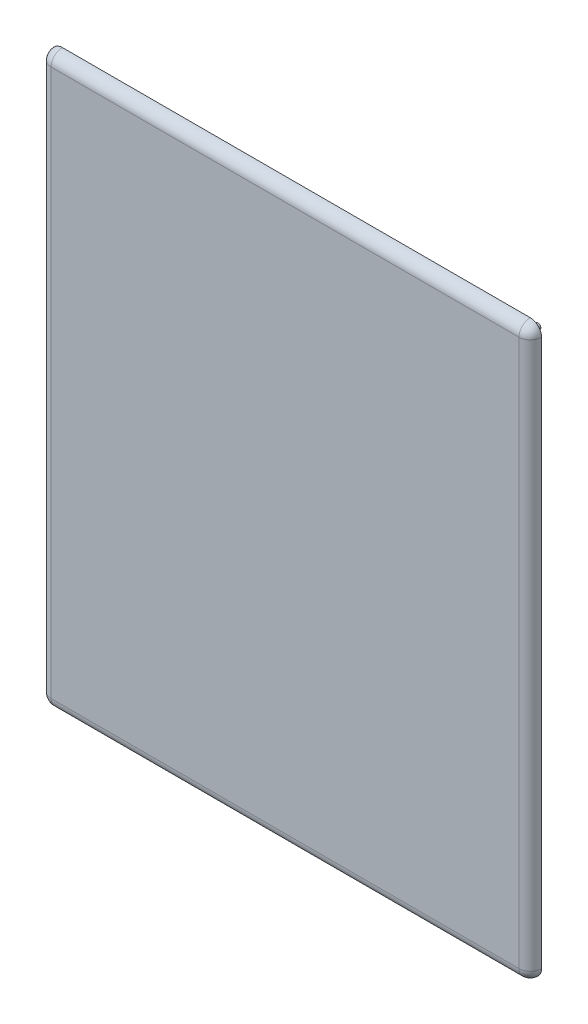
ISO-10303-21;
HEADER;
FILE_DESCRIPTION(('STEP AP214'),'2;1');
FILE_NAME('part.step','',(''),(''),'','','');
FILE_SCHEMA(('AUTOMOTIVE_DESIGN { 1 0 10303 214 1 1 1 1 }'));
ENDSEC;
DATA;
#1=APPLICATION_CONTEXT('core data for automotive mechanical design processes');
#2=APPLICATION_PROTOCOL_DEFINITION('international standard','automotive_design',2000,#1);
#3=PRODUCT_CONTEXT('',#1,'mechanical');
#4=PRODUCT('Part','Part','',(#3));
#5=PRODUCT_RELATED_PRODUCT_CATEGORY('part','',(#4));
#6=PRODUCT_DEFINITION_FORMATION('','',#4);
#7=PRODUCT_DEFINITION_CONTEXT('part definition',#1,'design');
#8=PRODUCT_DEFINITION('design','',#6,#7);
#9=PRODUCT_DEFINITION_SHAPE('','',#8);
#10=(LENGTH_UNIT() NAMED_UNIT(*) SI_UNIT(.MILLI.,.METRE.));
#11=(NAMED_UNIT(*) PLANE_ANGLE_UNIT() SI_UNIT($,.RADIAN.));
#12=(NAMED_UNIT(*) SI_UNIT($,.STERADIAN.) SOLID_ANGLE_UNIT());
#13=UNCERTAINTY_MEASURE_WITH_UNIT(LENGTH_MEASURE(1.E-05),#10,'distance_accuracy_value','');
#14=(GEOMETRIC_REPRESENTATION_CONTEXT(3) GLOBAL_UNCERTAINTY_ASSIGNED_CONTEXT((#13)) GLOBAL_UNIT_ASSIGNED_CONTEXT((#10,
#11,#12)) REPRESENTATION_CONTEXT('',''));
#15=CARTESIAN_POINT('',(0.,0.,0.));
#16=DIRECTION('',(0.,0.,1.));
#17=DIRECTION('',(1.,0.,0.));
#18=AXIS2_PLACEMENT_3D('',#15,#16,#17);
#19=CARTESIAN_POINT('',(0.,0.,5.08));
#20=DIRECTION('',(0.,0.,-1.));
#21=DIRECTION('',(-1.,0.,0.));
#22=AXIS2_PLACEMENT_3D('',#19,#20,#21);
#23=PLANE('',#22);
#24=DIRECTION('',(0.,-1.,0.));
#25=VECTOR('',#24,1.);
#26=CARTESIAN_POINT('',(5.08,0.,5.08));
#27=LINE('',#26,#25);
#28=CARTESIAN_POINT('',(5.08,251.46,5.08));
#29=VERTEX_POINT('',#28);
#30=CARTESIAN_POINT('',(5.08,5.08,5.08));
#31=VERTEX_POINT('',#30);
#32=EDGE_CURVE('E107',#29,#31,#27,.T.);
#33=ORIENTED_EDGE('',*,*,#32,.T.);
#34=DIRECTION('',(1.,0.,0.));
#35=VECTOR('',#34,1.);
#36=CARTESIAN_POINT('',(0.,5.08,5.08));
#37=LINE('',#36,#35);
#38=CARTESIAN_POINT('',(215.9,5.08,5.08));
#39=VERTEX_POINT('',#38);
#40=EDGE_CURVE('E106',#31,#39,#37,.T.);
#41=ORIENTED_EDGE('',*,*,#40,.T.);
#42=DIRECTION('',(0.,1.,0.));
#43=VECTOR('',#42,1.);
#44=CARTESIAN_POINT('',(215.9,0.,5.08));
#45=LINE('',#44,#43);
#46=CARTESIAN_POINT('',(215.9,251.46,5.08));
#47=VERTEX_POINT('',#46);
#48=EDGE_CURVE('E95',#39,#47,#45,.T.);
#49=ORIENTED_EDGE('',*,*,#48,.T.);
#50=DIRECTION('',(-1.,0.,0.));
#51=VECTOR('',#50,1.);
#52=CARTESIAN_POINT('',(0.,251.46,5.08));
#53=LINE('',#52,#51);
#54=EDGE_CURVE('E103',#47,#29,#53,.T.);
#55=ORIENTED_EDGE('',*,*,#54,.T.);
#56=EDGE_LOOP('',(#33,#41,#49,#55));
#57=FACE_BOUND('',#56,.T.);
#58=ADVANCED_FACE('F35',(#57),#23,.F.);
#59=CARTESIAN_POINT('',(0.,0.,0.));
#60=DIRECTION('',(0.,0.,-1.));
#61=DIRECTION('',(-1.,0.,0.));
#62=AXIS2_PLACEMENT_3D('',#59,#60,#61);
#63=PLANE('',#62);
#64=CARTESIAN_POINT('',(7.93750000000004,7.93750000000001,0.));
#65=DIRECTION('',(0.,0.,-1.));
#66=DIRECTION('',(-1.,0.,0.));
#67=AXIS2_PLACEMENT_3D('',#64,#65,#66);
#68=CIRCLE('',#67,1.27);
#69=CARTESIAN_POINT('',(6.66750000000004,7.93750000000001,0.));
#70=VERTEX_POINT('',#69);
#71=EDGE_CURVE('E175',#70,#70,#68,.T.);
#72=ORIENTED_EDGE('',*,*,#71,.F.);
#73=EDGE_LOOP('',(#72));
#74=FACE_BOUND('',#73,.T.);
#75=CARTESIAN_POINT('',(213.0425,7.93749999999999,0.));
#76=DIRECTION('',(0.,0.,-1.));
#77=DIRECTION('',(-1.,0.,0.));
#78=AXIS2_PLACEMENT_3D('',#75,#76,#77);
#79=CIRCLE('',#78,1.27);
#80=CARTESIAN_POINT('',(211.7725,7.93749999999999,0.));
#81=VERTEX_POINT('',#80);
#82=EDGE_CURVE('E169',#81,#81,#79,.T.);
#83=ORIENTED_EDGE('',*,*,#82,.F.);
#84=EDGE_LOOP('',(#83));
#85=FACE_BOUND('',#84,.T.);
#86=CARTESIAN_POINT('',(7.93750000000004,248.6025,0.));
#87=DIRECTION('',(0.,0.,-1.));
#88=DIRECTION('',(-1.,0.,0.));
#89=AXIS2_PLACEMENT_3D('',#86,#87,#88);
#90=CIRCLE('',#89,1.27);
#91=CARTESIAN_POINT('',(6.66750000000004,248.6025,0.));
#92=VERTEX_POINT('',#91);
#93=EDGE_CURVE('E163',#92,#92,#90,.T.);
#94=ORIENTED_EDGE('',*,*,#93,.F.);
#95=EDGE_LOOP('',(#94));
#96=FACE_BOUND('',#95,.T.);
#97=CARTESIAN_POINT('',(213.0425,248.6025,0.));
#98=DIRECTION('',(0.,0.,-1.));
#99=DIRECTION('',(-1.,0.,0.));
#100=AXIS2_PLACEMENT_3D('',#97,#98,#99);
#101=CIRCLE('',#100,1.27000000000001);
#102=CARTESIAN_POINT('',(211.7725,248.6025,0.));
#103=VERTEX_POINT('',#102);
#104=EDGE_CURVE('E157',#103,#103,#101,.T.);
#105=ORIENTED_EDGE('',*,*,#104,.F.);
#106=EDGE_LOOP('',(#105));
#107=FACE_BOUND('',#106,.T.);
#108=DIRECTION('',(1.,0.,0.));
#109=VECTOR('',#108,1.);
#110=CARTESIAN_POINT('',(0.,0.,0.));
#111=LINE('',#110,#109);
#112=CARTESIAN_POINT('',(5.08,0.,0.));
#113=VERTEX_POINT('',#112);
#114=CARTESIAN_POINT('',(215.9,0.,0.));
#115=VERTEX_POINT('',#114);
#116=EDGE_CURVE('E151',#113,#115,#111,.T.);
#117=ORIENTED_EDGE('',*,*,#116,.F.);
#118=CARTESIAN_POINT('',(5.08,5.08,0.));
#119=DIRECTION('',(0.,0.,-1.));
#120=DIRECTION('',(-1.,0.,0.));
#121=AXIS2_PLACEMENT_3D('',#118,#119,#120);
#122=CIRCLE('',#121,5.08);
#123=CARTESIAN_POINT('',(0.,5.08,0.));
#124=VERTEX_POINT('',#123);
#125=EDGE_CURVE('E129',#113,#124,#122,.T.);
#126=ORIENTED_EDGE('',*,*,#125,.T.);
#127=DIRECTION('',(0.,-1.,0.));
#128=VECTOR('',#127,1.);
#129=CARTESIAN_POINT('',(0.,0.,0.));
#130=LINE('',#129,#128);
#131=CARTESIAN_POINT('',(0.,251.46,0.));
#132=VERTEX_POINT('',#131);
#133=EDGE_CURVE('E141',#132,#124,#130,.T.);
#134=ORIENTED_EDGE('',*,*,#133,.F.);
#135=CARTESIAN_POINT('',(5.08,251.46,0.));
#136=DIRECTION('',(0.,0.,-1.));
#137=DIRECTION('',(-1.,0.,0.));
#138=AXIS2_PLACEMENT_3D('',#135,#136,#137);
#139=CIRCLE('',#138,5.08);
#140=CARTESIAN_POINT('',(5.08,256.54,0.));
#141=VERTEX_POINT('',#140);
#142=EDGE_CURVE('E124',#132,#141,#139,.T.);
#143=ORIENTED_EDGE('',*,*,#142,.T.);
#144=DIRECTION('',(-1.,0.,0.));
#145=VECTOR('',#144,1.);
#146=CARTESIAN_POINT('',(0.,256.54,0.));
#147=LINE('',#146,#145);
#148=CARTESIAN_POINT('',(215.9,256.54,0.));
#149=VERTEX_POINT('',#148);
#150=EDGE_CURVE('E111',#149,#141,#147,.T.);
#151=ORIENTED_EDGE('',*,*,#150,.F.);
#152=CARTESIAN_POINT('',(215.9,251.46,0.));
#153=DIRECTION('',(0.,0.,-1.));
#154=DIRECTION('',(-1.,0.,0.));
#155=AXIS2_PLACEMENT_3D('',#152,#153,#154);
#156=CIRCLE('',#155,5.08);
#157=CARTESIAN_POINT('',(220.98,251.46,0.));
#158=VERTEX_POINT('',#157);
#159=EDGE_CURVE('E50',#149,#158,#156,.T.);
#160=ORIENTED_EDGE('',*,*,#159,.T.);
#161=DIRECTION('',(0.,1.,0.));
#162=VECTOR('',#161,1.);
#163=CARTESIAN_POINT('',(220.98,0.,0.));
#164=LINE('',#163,#162);
#165=CARTESIAN_POINT('',(220.98,5.08,0.));
#166=VERTEX_POINT('',#165);
#167=EDGE_CURVE('E97',#166,#158,#164,.T.);
#168=ORIENTED_EDGE('',*,*,#167,.F.);
#169=CARTESIAN_POINT('',(215.9,5.08,0.));
#170=DIRECTION('',(0.,0.,-1.));
#171=DIRECTION('',(-1.,0.,0.));
#172=AXIS2_PLACEMENT_3D('',#169,#170,#171);
#173=CIRCLE('',#172,5.08);
#174=EDGE_CURVE('E127',#166,#115,#173,.T.);
#175=ORIENTED_EDGE('',*,*,#174,.T.);
#176=EDGE_LOOP('',(#117,#126,#134,#143,#151,#160,#168,#175));
#177=FACE_BOUND('',#176,.T.);
#178=ADVANCED_FACE('F150',(#74,#85,#96,#107,#177),#63,.T.);
#179=CARTESIAN_POINT('',(0.,251.46,0.));
#180=DIRECTION('',(-1.,0.,0.));
#181=DIRECTION('',(0.,0.,1.));
#182=AXIS2_PLACEMENT_3D('',#179,#180,#181);
#183=CYLINDRICAL_SURFACE('',#182,5.08);
#184=ORIENTED_EDGE('',*,*,#54,.F.);
#185=CARTESIAN_POINT('',(215.9,251.46,0.));
#186=DIRECTION('',(-1.,0.,0.));
#187=DIRECTION('',(0.,0.,1.));
#188=AXIS2_PLACEMENT_3D('',#185,#186,#187);
#189=CIRCLE('',#188,5.08);
#190=EDGE_CURVE('E11',#47,#149,#189,.T.);
#191=ORIENTED_EDGE('',*,*,#190,.T.);
#192=ORIENTED_EDGE('',*,*,#150,.T.);
#193=CARTESIAN_POINT('',(5.08,251.46,0.));
#194=DIRECTION('',(-1.,0.,0.));
#195=DIRECTION('',(0.,0.,1.));
#196=AXIS2_PLACEMENT_3D('',#193,#194,#195);
#197=CIRCLE('',#196,5.08);
#198=EDGE_CURVE('E43',#141,#29,#197,.F.);
#199=ORIENTED_EDGE('',*,*,#198,.T.);
#200=EDGE_LOOP('',(#184,#191,#192,#199));
#201=FACE_BOUND('',#200,.T.);
#202=ADVANCED_FACE('F109',(#201),#183,.T.);
#203=CARTESIAN_POINT('',(5.08,0.,0.));
#204=DIRECTION('',(0.,-1.,0.));
#205=DIRECTION('',(0.,0.,-1.));
#206=AXIS2_PLACEMENT_3D('',#203,#204,#205);
#207=CYLINDRICAL_SURFACE('',#206,5.08);
#208=ORIENTED_EDGE('',*,*,#133,.T.);
#209=CARTESIAN_POINT('',(5.08,5.08,0.));
#210=DIRECTION('',(0.,-1.,0.));
#211=DIRECTION('',(0.,0.,-1.));
#212=AXIS2_PLACEMENT_3D('',#209,#210,#211);
#213=CIRCLE('',#212,5.08);
#214=EDGE_CURVE('E98',#124,#31,#213,.F.);
#215=ORIENTED_EDGE('',*,*,#214,.T.);
#216=ORIENTED_EDGE('',*,*,#32,.F.);
#217=CARTESIAN_POINT('',(5.08,251.46,0.));
#218=DIRECTION('',(0.,-1.,0.));
#219=DIRECTION('',(0.,0.,-1.));
#220=AXIS2_PLACEMENT_3D('',#217,#218,#219);
#221=CIRCLE('',#220,5.08);
#222=EDGE_CURVE('E131',#29,#132,#221,.T.);
#223=ORIENTED_EDGE('',*,*,#222,.T.);
#224=EDGE_LOOP('',(#208,#215,#216,#223));
#225=FACE_BOUND('',#224,.T.);
#226=ADVANCED_FACE('F138',(#225),#207,.T.);
#227=CARTESIAN_POINT('',(215.9,0.,0.));
#228=DIRECTION('',(0.,1.,0.));
#229=DIRECTION('',(0.,0.,1.));
#230=AXIS2_PLACEMENT_3D('',#227,#228,#229);
#231=CYLINDRICAL_SURFACE('',#230,5.08);
#232=ORIENTED_EDGE('',*,*,#48,.F.);
#233=CARTESIAN_POINT('',(215.9,5.08,0.));
#234=DIRECTION('',(0.,1.,0.));
#235=DIRECTION('',(0.,0.,1.));
#236=AXIS2_PLACEMENT_3D('',#233,#234,#235);
#237=CIRCLE('',#236,5.08);
#238=EDGE_CURVE('E57',#39,#166,#237,.T.);
#239=ORIENTED_EDGE('',*,*,#238,.T.);
#240=ORIENTED_EDGE('',*,*,#167,.T.);
#241=CARTESIAN_POINT('',(215.9,251.46,0.));
#242=DIRECTION('',(0.,1.,0.));
#243=DIRECTION('',(0.,0.,1.));
#244=AXIS2_PLACEMENT_3D('',#241,#242,#243);
#245=CIRCLE('',#244,5.08);
#246=EDGE_CURVE('E89',#158,#47,#245,.F.);
#247=ORIENTED_EDGE('',*,*,#246,.T.);
#248=EDGE_LOOP('',(#232,#239,#240,#247));
#249=FACE_BOUND('',#248,.T.);
#250=ADVANCED_FACE('F94',(#249),#231,.T.);
#251=CARTESIAN_POINT('',(0.,5.08,0.));
#252=DIRECTION('',(1.,0.,0.));
#253=DIRECTION('',(0.,0.,-1.));
#254=AXIS2_PLACEMENT_3D('',#251,#252,#253);
#255=CYLINDRICAL_SURFACE('',#254,5.08);
#256=ORIENTED_EDGE('',*,*,#40,.F.);
#257=CARTESIAN_POINT('',(5.08,5.08,0.));
#258=DIRECTION('',(1.,0.,0.));
#259=DIRECTION('',(0.,0.,-1.));
#260=AXIS2_PLACEMENT_3D('',#257,#258,#259);
#261=CIRCLE('',#260,5.08);
#262=EDGE_CURVE('E121',#31,#113,#261,.T.);
#263=ORIENTED_EDGE('',*,*,#262,.T.);
#264=ORIENTED_EDGE('',*,*,#116,.T.);
#265=CARTESIAN_POINT('',(215.9,5.08,0.));
#266=DIRECTION('',(1.,0.,0.));
#267=DIRECTION('',(0.,0.,-1.));
#268=AXIS2_PLACEMENT_3D('',#265,#266,#267);
#269=CIRCLE('',#268,5.08);
#270=EDGE_CURVE('E118',#115,#39,#269,.F.);
#271=ORIENTED_EDGE('',*,*,#270,.T.);
#272=EDGE_LOOP('',(#256,#263,#264,#271));
#273=FACE_BOUND('',#272,.T.);
#274=ADVANCED_FACE('F145',(#273),#255,.T.);
#275=CARTESIAN_POINT('',(5.08,5.08,0.));
#276=DIRECTION('',(0.,0.,1.));
#277=DIRECTION('',(1.,0.,0.));
#278=AXIS2_PLACEMENT_3D('',#275,#276,#277);
#279=SPHERICAL_SURFACE('',#278,5.08);
#280=ORIENTED_EDGE('',*,*,#262,.F.);
#281=ORIENTED_EDGE('',*,*,#214,.F.);
#282=ORIENTED_EDGE('',*,*,#125,.F.);
#283=EDGE_LOOP('',(#280,#281,#282));
#284=FACE_BOUND('',#283,.T.);
#285=ADVANCED_FACE('F149',(#284),#279,.T.);
#286=CARTESIAN_POINT('',(215.9,5.08,0.));
#287=DIRECTION('',(0.,0.,1.));
#288=DIRECTION('',(1.,0.,0.));
#289=AXIS2_PLACEMENT_3D('',#286,#287,#288);
#290=SPHERICAL_SURFACE('',#289,5.08);
#291=ORIENTED_EDGE('',*,*,#174,.F.);
#292=ORIENTED_EDGE('',*,*,#238,.F.);
#293=ORIENTED_EDGE('',*,*,#270,.F.);
#294=EDGE_LOOP('',(#291,#292,#293));
#295=FACE_BOUND('',#294,.T.);
#296=ADVANCED_FACE('F229',(#295),#290,.T.);
#297=CARTESIAN_POINT('',(215.9,251.46,0.));
#298=DIRECTION('',(0.,0.,1.));
#299=DIRECTION('',(1.,0.,0.));
#300=AXIS2_PLACEMENT_3D('',#297,#298,#299);
#301=SPHERICAL_SURFACE('',#300,5.08);
#302=ORIENTED_EDGE('',*,*,#159,.F.);
#303=ORIENTED_EDGE('',*,*,#190,.F.);
#304=ORIENTED_EDGE('',*,*,#246,.F.);
#305=EDGE_LOOP('',(#302,#303,#304));
#306=FACE_BOUND('',#305,.T.);
#307=ADVANCED_FACE('F88',(#306),#301,.T.);
#308=CARTESIAN_POINT('',(5.08,251.46,0.));
#309=DIRECTION('',(0.,0.,1.));
#310=DIRECTION('',(1.,0.,0.));
#311=AXIS2_PLACEMENT_3D('',#308,#309,#310);
#312=SPHERICAL_SURFACE('',#311,5.08);
#313=ORIENTED_EDGE('',*,*,#222,.F.);
#314=ORIENTED_EDGE('',*,*,#198,.F.);
#315=ORIENTED_EDGE('',*,*,#142,.F.);
#316=EDGE_LOOP('',(#313,#314,#315));
#317=FACE_BOUND('',#316,.T.);
#318=ADVANCED_FACE('F37',(#317),#312,.T.);
#319=CARTESIAN_POINT('',(213.0425,248.6025,-6.35));
#320=DIRECTION('',(0.,0.,1.));
#321=DIRECTION('',(1.,0.,0.));
#322=AXIS2_PLACEMENT_3D('',#319,#320,#321);
#323=CYLINDRICAL_SURFACE('',#322,1.27000000000001);
#324=CARTESIAN_POINT('',(213.0425,248.6025,-6.35));
#325=DIRECTION('',(0.,0.,-1.));
#326=DIRECTION('',(-1.,0.,0.));
#327=AXIS2_PLACEMENT_3D('',#324,#325,#326);
#328=CIRCLE('',#327,1.27000000000001);
#329=CARTESIAN_POINT('',(211.7725,248.6025,-6.35));
#330=VERTEX_POINT('',#329);
#331=EDGE_CURVE('E154',#330,#330,#328,.T.);
#332=ORIENTED_EDGE('',*,*,#331,.F.);
#333=EDGE_LOOP('',(#332));
#334=FACE_BOUND('',#333,.T.);
#335=ORIENTED_EDGE('',*,*,#104,.T.);
#336=EDGE_LOOP('',(#335));
#337=FACE_BOUND('',#336,.T.);
#338=ADVANCED_FACE('F199',(#334,#337),#323,.T.);
#339=CARTESIAN_POINT('',(213.0425,248.6025,-6.35));
#340=DIRECTION('',(0.,0.,-1.));
#341=DIRECTION('',(-1.,0.,0.));
#342=AXIS2_PLACEMENT_3D('',#339,#340,#341);
#343=PLANE('',#342);
#344=ORIENTED_EDGE('',*,*,#331,.T.);
#345=EDGE_LOOP('',(#344));
#346=FACE_BOUND('',#345,.T.);
#347=ADVANCED_FACE('F201',(#346),#343,.T.);
#348=CARTESIAN_POINT('',(7.93750000000004,248.6025,-6.35));
#349=DIRECTION('',(0.,0.,1.));
#350=DIRECTION('',(1.,0.,0.));
#351=AXIS2_PLACEMENT_3D('',#348,#349,#350);
#352=CYLINDRICAL_SURFACE('',#351,1.27);
#353=CARTESIAN_POINT('',(7.93750000000004,248.6025,-6.35));
#354=DIRECTION('',(0.,0.,-1.));
#355=DIRECTION('',(-1.,0.,0.));
#356=AXIS2_PLACEMENT_3D('',#353,#354,#355);
#357=CIRCLE('',#356,1.27);
#358=CARTESIAN_POINT('',(6.66750000000004,248.6025,-6.35));
#359=VERTEX_POINT('',#358);
#360=EDGE_CURVE('E160',#359,#359,#357,.T.);
#361=ORIENTED_EDGE('',*,*,#360,.F.);
#362=EDGE_LOOP('',(#361));
#363=FACE_BOUND('',#362,.T.);
#364=ORIENTED_EDGE('',*,*,#93,.T.);
#365=EDGE_LOOP('',(#364));
#366=FACE_BOUND('',#365,.T.);
#367=ADVANCED_FACE('F208',(#363,#366),#352,.T.);
#368=CARTESIAN_POINT('',(7.93750000000004,248.6025,-6.35));
#369=DIRECTION('',(0.,0.,-1.));
#370=DIRECTION('',(-1.,0.,0.));
#371=AXIS2_PLACEMENT_3D('',#368,#369,#370);
#372=PLANE('',#371);
#373=ORIENTED_EDGE('',*,*,#360,.T.);
#374=EDGE_LOOP('',(#373));
#375=FACE_BOUND('',#374,.T.);
#376=ADVANCED_FACE('F271',(#375),#372,.T.);
#377=CARTESIAN_POINT('',(213.0425,7.93749999999999,-6.35));
#378=DIRECTION('',(0.,0.,1.));
#379=DIRECTION('',(1.,0.,0.));
#380=AXIS2_PLACEMENT_3D('',#377,#378,#379);
#381=CYLINDRICAL_SURFACE('',#380,1.27);
#382=CARTESIAN_POINT('',(213.0425,7.93749999999999,-6.35));
#383=DIRECTION('',(0.,0.,-1.));
#384=DIRECTION('',(-1.,0.,0.));
#385=AXIS2_PLACEMENT_3D('',#382,#383,#384);
#386=CIRCLE('',#385,1.27);
#387=CARTESIAN_POINT('',(211.7725,7.93749999999999,-6.35));
#388=VERTEX_POINT('',#387);
#389=EDGE_CURVE('E166',#388,#388,#386,.T.);
#390=ORIENTED_EDGE('',*,*,#389,.F.);
#391=EDGE_LOOP('',(#390));
#392=FACE_BOUND('',#391,.T.);
#393=ORIENTED_EDGE('',*,*,#82,.T.);
#394=EDGE_LOOP('',(#393));
#395=FACE_BOUND('',#394,.T.);
#396=ADVANCED_FACE('F281',(#392,#395),#381,.T.);
#397=CARTESIAN_POINT('',(213.0425,7.93749999999999,-6.35));
#398=DIRECTION('',(0.,0.,-1.));
#399=DIRECTION('',(-1.,0.,0.));
#400=AXIS2_PLACEMENT_3D('',#397,#398,#399);
#401=PLANE('',#400);
#402=ORIENTED_EDGE('',*,*,#389,.T.);
#403=EDGE_LOOP('',(#402));
#404=FACE_BOUND('',#403,.T.);
#405=ADVANCED_FACE('F186',(#404),#401,.T.);
#406=CARTESIAN_POINT('',(7.93750000000004,7.93750000000001,-6.35));
#407=DIRECTION('',(0.,0.,1.));
#408=DIRECTION('',(1.,0.,0.));
#409=AXIS2_PLACEMENT_3D('',#406,#407,#408);
#410=CYLINDRICAL_SURFACE('',#409,1.27);
#411=CARTESIAN_POINT('',(7.93750000000004,7.93750000000001,-6.35));
#412=DIRECTION('',(0.,0.,-1.));
#413=DIRECTION('',(-1.,0.,0.));
#414=AXIS2_PLACEMENT_3D('',#411,#412,#413);
#415=CIRCLE('',#414,1.27);
#416=CARTESIAN_POINT('',(6.66750000000004,7.93750000000001,-6.35));
#417=VERTEX_POINT('',#416);
#418=EDGE_CURVE('E172',#417,#417,#415,.T.);
#419=ORIENTED_EDGE('',*,*,#418,.F.);
#420=EDGE_LOOP('',(#419));
#421=FACE_BOUND('',#420,.T.);
#422=ORIENTED_EDGE('',*,*,#71,.T.);
#423=EDGE_LOOP('',(#422));
#424=FACE_BOUND('',#423,.T.);
#425=ADVANCED_FACE('F183',(#421,#424),#410,.T.);
#426=CARTESIAN_POINT('',(7.93750000000004,7.93750000000001,-6.35));
#427=DIRECTION('',(0.,0.,-1.));
#428=DIRECTION('',(-1.,0.,0.));
#429=AXIS2_PLACEMENT_3D('',#426,#427,#428);
#430=PLANE('',#429);
#431=ORIENTED_EDGE('',*,*,#418,.T.);
#432=EDGE_LOOP('',(#431));
#433=FACE_BOUND('',#432,.T.);
#434=ADVANCED_FACE('F181',(#433),#430,.T.);
#435=CLOSED_SHELL('',(#58,#178,#202,#226,#250,#274,#285,#296,#307,#318,#338,#347,#367,#376,#396,
#405,#425,#434));
#436=MANIFOLD_SOLID_BREP('B2',#435);
#437=ADVANCED_BREP_SHAPE_REPRESENTATION('',(#18,#436),#14);
#438=SHAPE_DEFINITION_REPRESENTATION(#9,#437);
ENDSEC;
END-ISO-10303-21;
